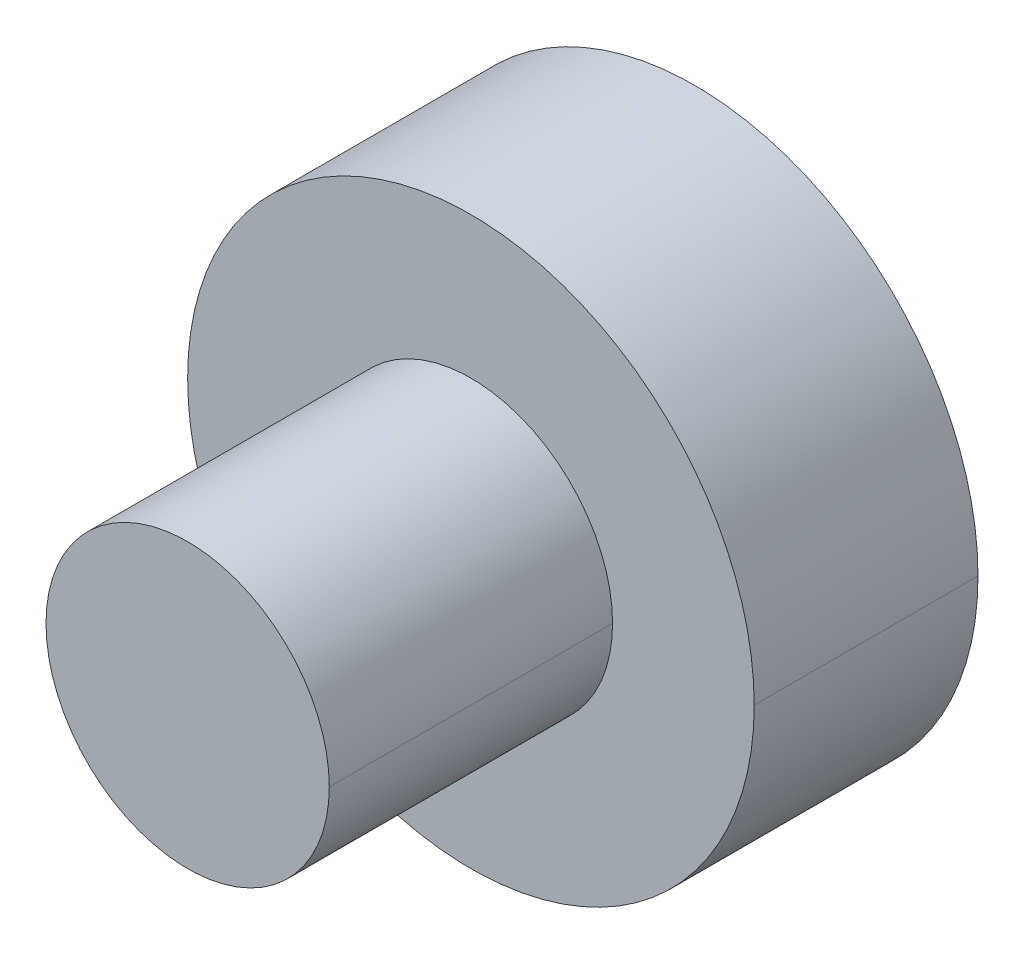
ISO-10303-21;
HEADER;
FILE_DESCRIPTION(('STEP AP214'),'2;1');
FILE_NAME('part.step','',(''),(''),'','','');
FILE_SCHEMA(('AUTOMOTIVE_DESIGN { 1 0 10303 214 1 1 1 1 }'));
ENDSEC;
DATA;
#1=APPLICATION_CONTEXT('core data for automotive mechanical design processes');
#2=APPLICATION_PROTOCOL_DEFINITION('international standard','automotive_design',2000,#1);
#3=PRODUCT_CONTEXT('',#1,'mechanical');
#4=PRODUCT('Part','Part','',(#3));
#5=PRODUCT_RELATED_PRODUCT_CATEGORY('part','',(#4));
#6=PRODUCT_DEFINITION_FORMATION('','',#4);
#7=PRODUCT_DEFINITION_CONTEXT('part definition',#1,'design');
#8=PRODUCT_DEFINITION('design','',#6,#7);
#9=PRODUCT_DEFINITION_SHAPE('','',#8);
#10=(LENGTH_UNIT() NAMED_UNIT(*) SI_UNIT(.MILLI.,.METRE.));
#11=(NAMED_UNIT(*) PLANE_ANGLE_UNIT() SI_UNIT($,.RADIAN.));
#12=(NAMED_UNIT(*) SI_UNIT($,.STERADIAN.) SOLID_ANGLE_UNIT());
#13=UNCERTAINTY_MEASURE_WITH_UNIT(LENGTH_MEASURE(1.E-05),#10,'distance_accuracy_value','');
#14=(GEOMETRIC_REPRESENTATION_CONTEXT(3) GLOBAL_UNCERTAINTY_ASSIGNED_CONTEXT((#13)) GLOBAL_UNIT_ASSIGNED_CONTEXT((#10,
#11,#12)) REPRESENTATION_CONTEXT('',''));
#15=CARTESIAN_POINT('',(0.,0.,0.));
#16=DIRECTION('',(0.,0.,1.));
#17=DIRECTION('',(1.,0.,0.));
#18=AXIS2_PLACEMENT_3D('',#15,#16,#17);
#19=CARTESIAN_POINT('',(0.,0.,17.9));
#20=DIRECTION('',(0.,0.,1.));
#21=DIRECTION('',(1.,0.,0.));
#22=AXIS2_PLACEMENT_3D('',#19,#20,#21);
#23=PLANE('',#22);
#24=CARTESIAN_POINT('',(0.,0.,17.9));
#25=DIRECTION('',(0.,0.,1.));
#26=DIRECTION('',(1.,0.,0.));
#27=AXIS2_PLACEMENT_3D('',#24,#25,#26);
#28=CIRCLE('',#27,5.);
#29=CARTESIAN_POINT('',(-5.,0.,17.9));
#30=VERTEX_POINT('',#29);
#31=CARTESIAN_POINT('',(5.,0.,17.9));
#32=VERTEX_POINT('',#31);
#33=EDGE_CURVE('E10',#30,#32,#28,.T.);
#34=ORIENTED_EDGE('',*,*,#33,.T.);
#35=CARTESIAN_POINT('',(0.,0.,17.9));
#36=DIRECTION('',(0.,0.,1.));
#37=DIRECTION('',(1.,0.,0.));
#38=AXIS2_PLACEMENT_3D('',#35,#36,#37);
#39=CIRCLE('',#38,5.);
#40=EDGE_CURVE('E93',#32,#30,#39,.T.);
#41=ORIENTED_EDGE('',*,*,#40,.T.);
#42=EDGE_LOOP('',(#34,#41));
#43=FACE_BOUND('',#42,.T.);
#44=ADVANCED_FACE('F15',(#43),#23,.T.);
#45=CARTESIAN_POINT('',(0.,0.,17.9));
#46=DIRECTION('',(0.,0.,-1.));
#47=DIRECTION('',(-1.,0.,0.));
#48=AXIS2_PLACEMENT_3D('',#45,#46,#47);
#49=CYLINDRICAL_SURFACE('',#48,5.);
#50=DIRECTION('',(0.,0.,-1.));
#51=VECTOR('',#50,1.);
#52=CARTESIAN_POINT('',(5.,0.,17.9));
#53=LINE('',#52,#51);
#54=CARTESIAN_POINT('',(5.,0.,7.9));
#55=VERTEX_POINT('',#54);
#56=EDGE_CURVE('E90',#32,#55,#53,.T.);
#57=ORIENTED_EDGE('',*,*,#56,.F.);
#58=ORIENTED_EDGE('',*,*,#33,.F.);
#59=DIRECTION('',(0.,0.,-1.));
#60=VECTOR('',#59,1.);
#61=CARTESIAN_POINT('',(-5.,0.,17.9));
#62=LINE('',#61,#60);
#63=CARTESIAN_POINT('',(-5.,0.,7.9));
#64=VERTEX_POINT('',#63);
#65=EDGE_CURVE('E79',#30,#64,#62,.T.);
#66=ORIENTED_EDGE('',*,*,#65,.T.);
#67=CARTESIAN_POINT('',(0.,0.,7.9));
#68=DIRECTION('',(0.,0.,1.));
#69=DIRECTION('',(1.,0.,0.));
#70=AXIS2_PLACEMENT_3D('',#67,#68,#69);
#71=CIRCLE('',#70,5.);
#72=EDGE_CURVE('E26',#64,#55,#71,.T.);
#73=ORIENTED_EDGE('',*,*,#72,.T.);
#74=EDGE_LOOP('',(#57,#58,#66,#73));
#75=FACE_BOUND('',#74,.T.);
#76=ADVANCED_FACE('F119',(#75),#49,.T.);
#77=CARTESIAN_POINT('',(0.,0.,0.));
#78=DIRECTION('',(0.,0.,1.));
#79=DIRECTION('',(1.,0.,0.));
#80=AXIS2_PLACEMENT_3D('',#77,#78,#79);
#81=PLANE('',#80);
#82=CARTESIAN_POINT('',(0.,0.,0.));
#83=DIRECTION('',(0.,0.,1.));
#84=DIRECTION('',(1.,0.,0.));
#85=AXIS2_PLACEMENT_3D('',#82,#83,#84);
#86=CIRCLE('',#85,10.);
#87=CARTESIAN_POINT('',(-10.,0.,0.));
#88=VERTEX_POINT('',#87);
#89=CARTESIAN_POINT('',(10.,0.,0.));
#90=VERTEX_POINT('',#89);
#91=EDGE_CURVE('E40',#88,#90,#86,.T.);
#92=ORIENTED_EDGE('',*,*,#91,.F.);
#93=CARTESIAN_POINT('',(0.,0.,0.));
#94=DIRECTION('',(0.,0.,1.));
#95=DIRECTION('',(1.,0.,0.));
#96=AXIS2_PLACEMENT_3D('',#93,#94,#95);
#97=CIRCLE('',#96,10.);
#98=EDGE_CURVE('E75',#90,#88,#97,.T.);
#99=ORIENTED_EDGE('',*,*,#98,.F.);
#100=EDGE_LOOP('',(#92,#99));
#101=FACE_BOUND('',#100,.T.);
#102=ADVANCED_FACE('F117',(#101),#81,.F.);
#103=CARTESIAN_POINT('',(0.,0.,7.9));
#104=DIRECTION('',(0.,0.,1.));
#105=DIRECTION('',(1.,0.,0.));
#106=AXIS2_PLACEMENT_3D('',#103,#104,#105);
#107=PLANE('',#106);
#108=ORIENTED_EDGE('',*,*,#72,.F.);
#109=CARTESIAN_POINT('',(0.,0.,7.9));
#110=DIRECTION('',(0.,0.,1.));
#111=DIRECTION('',(1.,0.,0.));
#112=AXIS2_PLACEMENT_3D('',#109,#110,#111);
#113=CIRCLE('',#112,5.);
#114=EDGE_CURVE('E86',#55,#64,#113,.T.);
#115=ORIENTED_EDGE('',*,*,#114,.F.);
#116=EDGE_LOOP('',(#108,#115));
#117=FACE_BOUND('',#116,.T.);
#118=CARTESIAN_POINT('',(0.,0.,7.9));
#119=DIRECTION('',(0.,0.,1.));
#120=DIRECTION('',(1.,0.,0.));
#121=AXIS2_PLACEMENT_3D('',#118,#119,#120);
#122=CIRCLE('',#121,10.);
#123=CARTESIAN_POINT('',(-10.,0.,7.9));
#124=VERTEX_POINT('',#123);
#125=CARTESIAN_POINT('',(10.,0.,7.9));
#126=VERTEX_POINT('',#125);
#127=EDGE_CURVE('E19',#124,#126,#122,.T.);
#128=ORIENTED_EDGE('',*,*,#127,.T.);
#129=CARTESIAN_POINT('',(0.,0.,7.9));
#130=DIRECTION('',(0.,0.,1.));
#131=DIRECTION('',(1.,0.,0.));
#132=AXIS2_PLACEMENT_3D('',#129,#130,#131);
#133=CIRCLE('',#132,10.);
#134=EDGE_CURVE('E64',#126,#124,#133,.T.);
#135=ORIENTED_EDGE('',*,*,#134,.T.);
#136=EDGE_LOOP('',(#128,#135));
#137=FACE_BOUND('',#136,.T.);
#138=ADVANCED_FACE('F17',(#117,#137),#107,.T.);
#139=CARTESIAN_POINT('',(0.,0.,7.9));
#140=DIRECTION('',(0.,0.,-1.));
#141=DIRECTION('',(-1.,0.,0.));
#142=AXIS2_PLACEMENT_3D('',#139,#140,#141);
#143=CYLINDRICAL_SURFACE('',#142,10.);
#144=DIRECTION('',(0.,0.,-1.));
#145=VECTOR('',#144,1.);
#146=CARTESIAN_POINT('',(10.,0.,7.9));
#147=LINE('',#146,#145);
#148=EDGE_CURVE('E70',#126,#90,#147,.T.);
#149=ORIENTED_EDGE('',*,*,#148,.F.);
#150=ORIENTED_EDGE('',*,*,#127,.F.);
#151=DIRECTION('',(0.,0.,-1.));
#152=VECTOR('',#151,1.);
#153=CARTESIAN_POINT('',(-10.,0.,7.9));
#154=LINE('',#153,#152);
#155=EDGE_CURVE('E68',#124,#88,#154,.T.);
#156=ORIENTED_EDGE('',*,*,#155,.T.);
#157=ORIENTED_EDGE('',*,*,#91,.T.);
#158=EDGE_LOOP('',(#149,#150,#156,#157));
#159=FACE_BOUND('',#158,.T.);
#160=ADVANCED_FACE('F71',(#159),#143,.T.);
#161=CARTESIAN_POINT('',(0.,0.,7.9));
#162=DIRECTION('',(0.,0.,-1.));
#163=DIRECTION('',(-1.,0.,0.));
#164=AXIS2_PLACEMENT_3D('',#161,#162,#163);
#165=CYLINDRICAL_SURFACE('',#164,10.);
#166=ORIENTED_EDGE('',*,*,#134,.F.);
#167=ORIENTED_EDGE('',*,*,#148,.T.);
#168=ORIENTED_EDGE('',*,*,#98,.T.);
#169=ORIENTED_EDGE('',*,*,#155,.F.);
#170=EDGE_LOOP('',(#166,#167,#168,#169));
#171=FACE_BOUND('',#170,.T.);
#172=ADVANCED_FACE('F77',(#171),#165,.T.);
#173=CARTESIAN_POINT('',(0.,0.,17.9));
#174=DIRECTION('',(0.,0.,-1.));
#175=DIRECTION('',(-1.,0.,0.));
#176=AXIS2_PLACEMENT_3D('',#173,#174,#175);
#177=CYLINDRICAL_SURFACE('',#176,5.);
#178=ORIENTED_EDGE('',*,*,#40,.F.);
#179=ORIENTED_EDGE('',*,*,#56,.T.);
#180=ORIENTED_EDGE('',*,*,#114,.T.);
#181=ORIENTED_EDGE('',*,*,#65,.F.);
#182=EDGE_LOOP('',(#178,#179,#180,#181));
#183=FACE_BOUND('',#182,.T.);
#184=ADVANCED_FACE('F135',(#183),#177,.T.);
#185=CLOSED_SHELL('',(#44,#76,#102,#138,#160,#172,#184));
#186=MANIFOLD_SOLID_BREP('B1',#185);
#187=ADVANCED_BREP_SHAPE_REPRESENTATION('',(#18,#186),#14);
#188=SHAPE_DEFINITION_REPRESENTATION(#9,#187);
ENDSEC;
END-ISO-10303-21;
